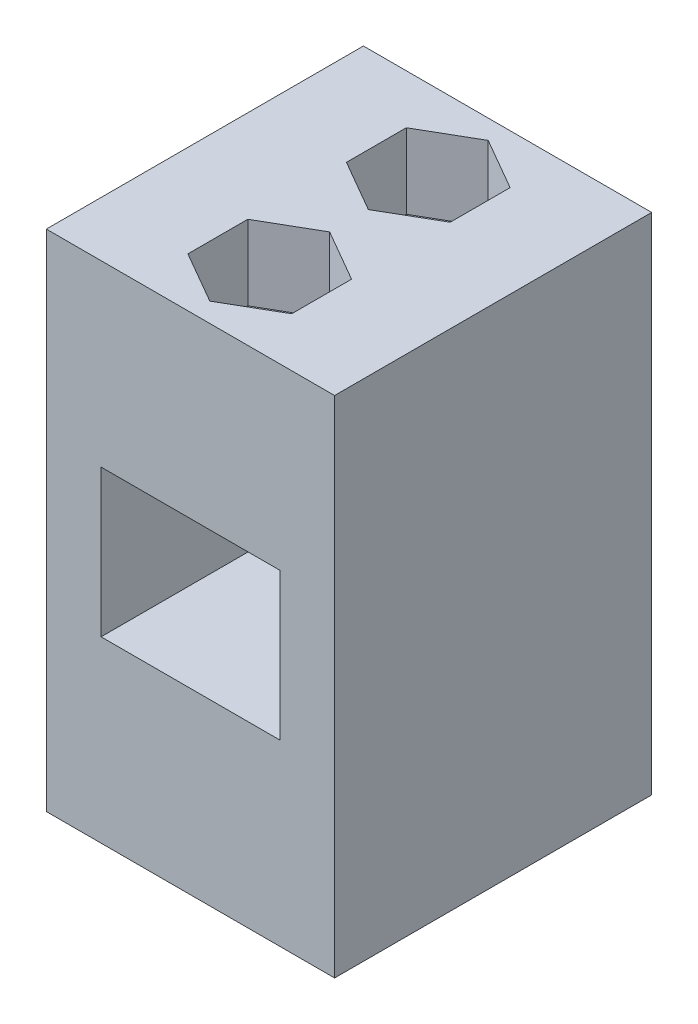
ISO-10303-21;
HEADER;
FILE_DESCRIPTION(('STEP AP214'),'2;1');
FILE_NAME('part.step','',(''),(''),'','','');
FILE_SCHEMA(('AUTOMOTIVE_DESIGN { 1 0 10303 214 1 1 1 1 }'));
ENDSEC;
DATA;
#1=APPLICATION_CONTEXT('core data for automotive mechanical design processes');
#2=APPLICATION_PROTOCOL_DEFINITION('international standard','automotive_design',2000,#1);
#3=PRODUCT_CONTEXT('',#1,'mechanical');
#4=PRODUCT('Part','Part','',(#3));
#5=PRODUCT_RELATED_PRODUCT_CATEGORY('part','',(#4));
#6=PRODUCT_DEFINITION_FORMATION('','',#4);
#7=PRODUCT_DEFINITION_CONTEXT('part definition',#1,'design');
#8=PRODUCT_DEFINITION('design','',#6,#7);
#9=PRODUCT_DEFINITION_SHAPE('','',#8);
#10=(LENGTH_UNIT() NAMED_UNIT(*) SI_UNIT(.MILLI.,.METRE.));
#11=(NAMED_UNIT(*) PLANE_ANGLE_UNIT() SI_UNIT($,.RADIAN.));
#12=(NAMED_UNIT(*) SI_UNIT($,.STERADIAN.) SOLID_ANGLE_UNIT());
#13=UNCERTAINTY_MEASURE_WITH_UNIT(LENGTH_MEASURE(1.E-05),#10,'distance_accuracy_value','');
#14=(GEOMETRIC_REPRESENTATION_CONTEXT(3) GLOBAL_UNCERTAINTY_ASSIGNED_CONTEXT((#13)) GLOBAL_UNIT_ASSIGNED_CONTEXT((#10,
#11,#12)) REPRESENTATION_CONTEXT('',''));
#15=CARTESIAN_POINT('',(0.,0.,0.));
#16=DIRECTION('',(0.,0.,1.));
#17=DIRECTION('',(1.,0.,0.));
#18=AXIS2_PLACEMENT_3D('',#15,#16,#17);
#19=CARTESIAN_POINT('',(-10.,-17.5,11.));
#20=DIRECTION('',(0.,-1.,0.));
#21=DIRECTION('',(0.,0.,-1.));
#22=AXIS2_PLACEMENT_3D('',#19,#20,#21);
#23=PLANE('',#22);
#24=DIRECTION('',(0.,0.,1.));
#25=VECTOR('',#24,1.);
#26=CARTESIAN_POINT('',(3.59999999999999,-17.5,3.42153903091735));
#27=LINE('',#26,#25);
#28=CARTESIAN_POINT('',(3.59999999999999,-17.5,3.42153903091735));
#29=VERTEX_POINT('',#28);
#30=CARTESIAN_POINT('',(3.6,-17.5,7.57846096908265));
#31=VERTEX_POINT('',#30);
#32=EDGE_CURVE('E57',#29,#31,#27,.T.);
#33=ORIENTED_EDGE('',*,*,#32,.F.);
#34=DIRECTION('',(0.866025403784439,0.,0.5));
#35=VECTOR('',#34,1.);
#36=CARTESIAN_POINT('',(0.,-17.5,1.3430780618347));
#37=LINE('',#36,#35);
#38=CARTESIAN_POINT('',(0.,-17.5,1.3430780618347));
#39=VERTEX_POINT('',#38);
#40=EDGE_CURVE('E276',#39,#29,#37,.T.);
#41=ORIENTED_EDGE('',*,*,#40,.F.);
#42=DIRECTION('',(0.866025403784439,0.,-0.5));
#43=VECTOR('',#42,1.);
#44=CARTESIAN_POINT('',(-3.59999999999999,-17.5,3.42153903091735));
#45=LINE('',#44,#43);
#46=CARTESIAN_POINT('',(-3.59999999999999,-17.5,3.42153903091735));
#47=VERTEX_POINT('',#46);
#48=EDGE_CURVE('E279',#47,#39,#45,.T.);
#49=ORIENTED_EDGE('',*,*,#48,.F.);
#50=DIRECTION('',(0.,0.,-1.));
#51=VECTOR('',#50,1.);
#52=CARTESIAN_POINT('',(-3.59999999999999,-17.5,7.57846096908265));
#53=LINE('',#52,#51);
#54=CARTESIAN_POINT('',(-3.59999999999999,-17.5,7.57846096908265));
#55=VERTEX_POINT('',#54);
#56=EDGE_CURVE('E295',#55,#47,#53,.T.);
#57=ORIENTED_EDGE('',*,*,#56,.F.);
#58=DIRECTION('',(-0.866025403784439,0.,-0.5));
#59=VECTOR('',#58,1.);
#60=CARTESIAN_POINT('',(0.,-17.5,9.6569219381653));
#61=LINE('',#60,#59);
#62=CARTESIAN_POINT('',(0.,-17.5,9.6569219381653));
#63=VERTEX_POINT('',#62);
#64=EDGE_CURVE('E292',#63,#55,#61,.T.);
#65=ORIENTED_EDGE('',*,*,#64,.F.);
#66=DIRECTION('',(-0.866025403784438,0.,0.5));
#67=VECTOR('',#66,1.);
#68=CARTESIAN_POINT('',(3.6,-17.5,7.57846096908265));
#69=LINE('',#68,#67);
#70=EDGE_CURVE('E290',#31,#63,#69,.T.);
#71=ORIENTED_EDGE('',*,*,#70,.F.);
#72=EDGE_LOOP('',(#33,#41,#49,#57,#65,#71));
#73=FACE_BOUND('',#72,.T.);
#74=DIRECTION('',(1.,0.,0.));
#75=VECTOR('',#74,1.);
#76=CARTESIAN_POINT('',(-10.,-17.5,-11.));
#77=LINE('',#76,#75);
#78=CARTESIAN_POINT('',(-10.,-17.5,-11.));
#79=VERTEX_POINT('',#78);
#80=CARTESIAN_POINT('',(10.,-17.5,-11.));
#81=VERTEX_POINT('',#80);
#82=EDGE_CURVE('E503',#79,#81,#77,.T.);
#83=ORIENTED_EDGE('',*,*,#82,.T.);
#84=DIRECTION('',(0.,0.,-1.));
#85=VECTOR('',#84,1.);
#86=CARTESIAN_POINT('',(10.,-17.5,11.));
#87=LINE('',#86,#85);
#88=CARTESIAN_POINT('',(10.,-17.5,11.));
#89=VERTEX_POINT('',#88);
#90=EDGE_CURVE('E486',#89,#81,#87,.T.);
#91=ORIENTED_EDGE('',*,*,#90,.F.);
#92=DIRECTION('',(1.,0.,0.));
#93=VECTOR('',#92,1.);
#94=CARTESIAN_POINT('',(-10.,-17.5,11.));
#95=LINE('',#94,#93);
#96=CARTESIAN_POINT('',(-10.,-17.5,11.));
#97=VERTEX_POINT('',#96);
#98=EDGE_CURVE('E506',#97,#89,#95,.T.);
#99=ORIENTED_EDGE('',*,*,#98,.F.);
#100=DIRECTION('',(0.,0.,-1.));
#101=VECTOR('',#100,1.);
#102=CARTESIAN_POINT('',(-10.,-17.5,11.));
#103=LINE('',#102,#101);
#104=EDGE_CURVE('E499',#97,#79,#103,.T.);
#105=ORIENTED_EDGE('',*,*,#104,.T.);
#106=EDGE_LOOP('',(#83,#91,#99,#105));
#107=FACE_BOUND('',#106,.T.);
#108=DIRECTION('',(0.866025403784439,0.,-0.5));
#109=VECTOR('',#108,1.);
#110=CARTESIAN_POINT('',(0.,-17.5,-1.3430780618347));
#111=LINE('',#110,#109);
#112=CARTESIAN_POINT('',(0.,-17.5,-1.3430780618347));
#113=VERTEX_POINT('',#112);
#114=CARTESIAN_POINT('',(3.59999999999999,-17.5,-3.42153903091735));
#115=VERTEX_POINT('',#114);
#116=EDGE_CURVE('E325',#113,#115,#111,.T.);
#117=ORIENTED_EDGE('',*,*,#116,.T.);
#118=DIRECTION('',(0.,0.,-1.));
#119=VECTOR('',#118,1.);
#120=CARTESIAN_POINT('',(3.59999999999999,-17.5,-3.42153903091735));
#121=LINE('',#120,#119);
#122=CARTESIAN_POINT('',(3.6,-17.5,-7.57846096908265));
#123=VERTEX_POINT('',#122);
#124=EDGE_CURVE('E65',#115,#123,#121,.T.);
#125=ORIENTED_EDGE('',*,*,#124,.T.);
#126=DIRECTION('',(-0.866025403784438,0.,-0.5));
#127=VECTOR('',#126,1.);
#128=CARTESIAN_POINT('',(3.6,-17.5,-7.57846096908265));
#129=LINE('',#128,#127);
#130=CARTESIAN_POINT('',(0.,-17.5,-9.6569219381653));
#131=VERTEX_POINT('',#130);
#132=EDGE_CURVE('E313',#123,#131,#129,.T.);
#133=ORIENTED_EDGE('',*,*,#132,.T.);
#134=DIRECTION('',(-0.866025403784439,0.,0.5));
#135=VECTOR('',#134,1.);
#136=CARTESIAN_POINT('',(0.,-17.5,-9.6569219381653));
#137=LINE('',#136,#135);
#138=CARTESIAN_POINT('',(-3.59999999999999,-17.5,-7.57846096908265));
#139=VERTEX_POINT('',#138);
#140=EDGE_CURVE('E334',#131,#139,#137,.T.);
#141=ORIENTED_EDGE('',*,*,#140,.T.);
#142=DIRECTION('',(0.,0.,1.));
#143=VECTOR('',#142,1.);
#144=CARTESIAN_POINT('',(-3.59999999999999,-17.5,-7.57846096908265));
#145=LINE('',#144,#143);
#146=CARTESIAN_POINT('',(-3.59999999999999,-17.5,-3.42153903091735));
#147=VERTEX_POINT('',#146);
#148=EDGE_CURVE('E331',#139,#147,#145,.T.);
#149=ORIENTED_EDGE('',*,*,#148,.T.);
#150=DIRECTION('',(0.866025403784439,0.,0.5));
#151=VECTOR('',#150,1.);
#152=CARTESIAN_POINT('',(-3.59999999999999,-17.5,-3.42153903091735));
#153=LINE('',#152,#151);
#154=EDGE_CURVE('E328',#147,#113,#153,.T.);
#155=ORIENTED_EDGE('',*,*,#154,.T.);
#156=EDGE_LOOP('',(#117,#125,#133,#141,#149,#155));
#157=FACE_BOUND('',#156,.T.);
#158=ADVANCED_FACE('F42',(#73,#107,#157),#23,.T.);
#159=CARTESIAN_POINT('',(-10.,17.5,11.));
#160=DIRECTION('',(0.,1.,0.));
#161=DIRECTION('',(0.,0.,1.));
#162=AXIS2_PLACEMENT_3D('',#159,#160,#161);
#163=PLANE('',#162);
#164=DIRECTION('',(0.,0.,-1.));
#165=VECTOR('',#164,1.);
#166=CARTESIAN_POINT('',(3.59999999999999,17.5,-3.42153903091735));
#167=LINE('',#166,#165);
#168=CARTESIAN_POINT('',(3.59999999999999,17.5,-3.42153903091735));
#169=VERTEX_POINT('',#168);
#170=CARTESIAN_POINT('',(3.6,17.5,-7.57846096908266));
#171=VERTEX_POINT('',#170);
#172=EDGE_CURVE('E385',#169,#171,#167,.T.);
#173=ORIENTED_EDGE('',*,*,#172,.F.);
#174=DIRECTION('',(0.866025403784439,0.,-0.5));
#175=VECTOR('',#174,1.);
#176=CARTESIAN_POINT('',(0.,17.5,-1.3430780618347));
#177=LINE('',#176,#175);
#178=CARTESIAN_POINT('',(0.,17.5,-1.3430780618347));
#179=VERTEX_POINT('',#178);
#180=EDGE_CURVE('E401',#179,#169,#177,.T.);
#181=ORIENTED_EDGE('',*,*,#180,.F.);
#182=DIRECTION('',(0.866025403784439,0.,0.5));
#183=VECTOR('',#182,1.);
#184=CARTESIAN_POINT('',(-3.59999999999999,17.5,-3.42153903091735));
#185=LINE('',#184,#183);
#186=CARTESIAN_POINT('',(-3.59999999999999,17.5,-3.42153903091735));
#187=VERTEX_POINT('',#186);
#188=EDGE_CURVE('E431',#187,#179,#185,.T.);
#189=ORIENTED_EDGE('',*,*,#188,.F.);
#190=DIRECTION('',(0.,0.,1.));
#191=VECTOR('',#190,1.);
#192=CARTESIAN_POINT('',(-3.59999999999999,17.5,-7.57846096908265));
#193=LINE('',#192,#191);
#194=CARTESIAN_POINT('',(-3.59999999999999,17.5,-7.57846096908265));
#195=VERTEX_POINT('',#194);
#196=EDGE_CURVE('E427',#195,#187,#193,.T.);
#197=ORIENTED_EDGE('',*,*,#196,.F.);
#198=DIRECTION('',(-0.866025403784439,0.,0.5));
#199=VECTOR('',#198,1.);
#200=CARTESIAN_POINT('',(0.,17.5,-9.6569219381653));
#201=LINE('',#200,#199);
#202=CARTESIAN_POINT('',(0.,17.5,-9.6569219381653));
#203=VERTEX_POINT('',#202);
#204=EDGE_CURVE('E424',#203,#195,#201,.T.);
#205=ORIENTED_EDGE('',*,*,#204,.F.);
#206=DIRECTION('',(-0.866025403784438,0.,-0.5));
#207=VECTOR('',#206,1.);
#208=CARTESIAN_POINT('',(3.6,17.5,-7.57846096908265));
#209=LINE('',#208,#207);
#210=EDGE_CURVE('E421',#171,#203,#209,.T.);
#211=ORIENTED_EDGE('',*,*,#210,.F.);
#212=EDGE_LOOP('',(#173,#181,#189,#197,#205,#211));
#213=FACE_BOUND('',#212,.T.);
#214=DIRECTION('',(1.,0.,0.));
#215=VECTOR('',#214,1.);
#216=CARTESIAN_POINT('',(-10.,17.5,11.));
#217=LINE('',#216,#215);
#218=CARTESIAN_POINT('',(-10.,17.5,11.));
#219=VERTEX_POINT('',#218);
#220=CARTESIAN_POINT('',(10.,17.5,11.));
#221=VERTEX_POINT('',#220);
#222=EDGE_CURVE('E508',#219,#221,#217,.T.);
#223=ORIENTED_EDGE('',*,*,#222,.T.);
#224=DIRECTION('',(0.,0.,1.));
#225=VECTOR('',#224,1.);
#226=CARTESIAN_POINT('',(10.,17.5,11.));
#227=LINE('',#226,#225);
#228=CARTESIAN_POINT('',(10.,17.5,-11.));
#229=VERTEX_POINT('',#228);
#230=EDGE_CURVE('E480',#229,#221,#227,.T.);
#231=ORIENTED_EDGE('',*,*,#230,.F.);
#232=DIRECTION('',(1.,0.,0.));
#233=VECTOR('',#232,1.);
#234=CARTESIAN_POINT('',(-10.,17.5,-11.));
#235=LINE('',#234,#233);
#236=CARTESIAN_POINT('',(-10.,17.5,-11.));
#237=VERTEX_POINT('',#236);
#238=EDGE_CURVE('E502',#237,#229,#235,.T.);
#239=ORIENTED_EDGE('',*,*,#238,.F.);
#240=DIRECTION('',(0.,0.,1.));
#241=VECTOR('',#240,1.);
#242=CARTESIAN_POINT('',(-10.,17.5,11.));
#243=LINE('',#242,#241);
#244=EDGE_CURVE('E493',#237,#219,#243,.T.);
#245=ORIENTED_EDGE('',*,*,#244,.T.);
#246=EDGE_LOOP('',(#223,#231,#239,#245));
#247=FACE_BOUND('',#246,.T.);
#248=DIRECTION('',(0.866025403784439,0.,0.5));
#249=VECTOR('',#248,1.);
#250=CARTESIAN_POINT('',(0.,17.5,1.3430780618347));
#251=LINE('',#250,#249);
#252=CARTESIAN_POINT('',(0.,17.5,1.3430780618347));
#253=VERTEX_POINT('',#252);
#254=CARTESIAN_POINT('',(3.6,17.5,3.42153903091735));
#255=VERTEX_POINT('',#254);
#256=EDGE_CURVE('E368',#253,#255,#251,.T.);
#257=ORIENTED_EDGE('',*,*,#256,.T.);
#258=DIRECTION('',(0.,0.,1.));
#259=VECTOR('',#258,1.);
#260=CARTESIAN_POINT('',(3.59999999999999,17.5,3.42153903091735));
#261=LINE('',#260,#259);
#262=CARTESIAN_POINT('',(3.6,17.5,7.57846096908265));
#263=VERTEX_POINT('',#262);
#264=EDGE_CURVE('E341',#255,#263,#261,.T.);
#265=ORIENTED_EDGE('',*,*,#264,.T.);
#266=DIRECTION('',(-0.866025403784438,0.,0.5));
#267=VECTOR('',#266,1.);
#268=CARTESIAN_POINT('',(3.6,17.5,7.57846096908265));
#269=LINE('',#268,#267);
#270=CARTESIAN_POINT('',(0.,17.5,9.6569219381653));
#271=VERTEX_POINT('',#270);
#272=EDGE_CURVE('E355',#263,#271,#269,.T.);
#273=ORIENTED_EDGE('',*,*,#272,.T.);
#274=DIRECTION('',(-0.866025403784439,0.,-0.5));
#275=VECTOR('',#274,1.);
#276=CARTESIAN_POINT('',(0.,17.5,9.6569219381653));
#277=LINE('',#276,#275);
#278=CARTESIAN_POINT('',(-3.59999999999999,17.5,7.57846096908265));
#279=VERTEX_POINT('',#278);
#280=EDGE_CURVE('E377',#271,#279,#277,.T.);
#281=ORIENTED_EDGE('',*,*,#280,.T.);
#282=DIRECTION('',(0.,0.,-1.));
#283=VECTOR('',#282,1.);
#284=CARTESIAN_POINT('',(-3.59999999999999,17.5,7.57846096908265));
#285=LINE('',#284,#283);
#286=CARTESIAN_POINT('',(-3.59999999999999,17.5,3.42153903091735));
#287=VERTEX_POINT('',#286);
#288=EDGE_CURVE('E374',#279,#287,#285,.T.);
#289=ORIENTED_EDGE('',*,*,#288,.T.);
#290=DIRECTION('',(0.866025403784439,0.,-0.5));
#291=VECTOR('',#290,1.);
#292=CARTESIAN_POINT('',(-3.59999999999999,17.5,3.42153903091735));
#293=LINE('',#292,#291);
#294=EDGE_CURVE('E371',#287,#253,#293,.T.);
#295=ORIENTED_EDGE('',*,*,#294,.T.);
#296=EDGE_LOOP('',(#257,#265,#273,#281,#289,#295));
#297=FACE_BOUND('',#296,.T.);
#298=ADVANCED_FACE('F535',(#213,#247,#297),#163,.T.);
#299=CARTESIAN_POINT('',(-10.,17.5,-11.));
#300=DIRECTION('',(0.,0.,-1.));
#301=DIRECTION('',(0.,1.,0.));
#302=AXIS2_PLACEMENT_3D('',#299,#300,#301);
#303=PLANE('',#302);
#304=DIRECTION('',(0.,1.,0.));
#305=VECTOR('',#304,1.);
#306=CARTESIAN_POINT('',(6.2,5.1,-11.));
#307=LINE('',#306,#305);
#308=CARTESIAN_POINT('',(6.2,-5.1,-11.));
#309=VERTEX_POINT('',#308);
#310=CARTESIAN_POINT('',(6.2,5.1,-11.));
#311=VERTEX_POINT('',#310);
#312=EDGE_CURVE('E439',#309,#311,#307,.T.);
#313=ORIENTED_EDGE('',*,*,#312,.T.);
#314=DIRECTION('',(-1.,0.,0.));
#315=VECTOR('',#314,1.);
#316=CARTESIAN_POINT('',(-6.2,5.1,-11.));
#317=LINE('',#316,#315);
#318=CARTESIAN_POINT('',(-6.2,5.1,-11.));
#319=VERTEX_POINT('',#318);
#320=EDGE_CURVE('E454',#311,#319,#317,.T.);
#321=ORIENTED_EDGE('',*,*,#320,.T.);
#322=DIRECTION('',(0.,-1.,0.));
#323=VECTOR('',#322,1.);
#324=CARTESIAN_POINT('',(-6.2,5.1,-11.));
#325=LINE('',#324,#323);
#326=CARTESIAN_POINT('',(-6.2,-5.1,-11.));
#327=VERTEX_POINT('',#326);
#328=EDGE_CURVE('E457',#319,#327,#325,.T.);
#329=ORIENTED_EDGE('',*,*,#328,.T.);
#330=DIRECTION('',(1.,0.,0.));
#331=VECTOR('',#330,1.);
#332=CARTESIAN_POINT('',(-6.2,-5.1,-11.));
#333=LINE('',#332,#331);
#334=EDGE_CURVE('E460',#327,#309,#333,.T.);
#335=ORIENTED_EDGE('',*,*,#334,.T.);
#336=EDGE_LOOP('',(#313,#321,#329,#335));
#337=FACE_BOUND('',#336,.T.);
#338=ORIENTED_EDGE('',*,*,#238,.T.);
#339=DIRECTION('',(0.,1.,0.));
#340=VECTOR('',#339,1.);
#341=CARTESIAN_POINT('',(10.,17.5,-11.));
#342=LINE('',#341,#340);
#343=EDGE_CURVE('E467',#81,#229,#342,.T.);
#344=ORIENTED_EDGE('',*,*,#343,.F.);
#345=ORIENTED_EDGE('',*,*,#82,.F.);
#346=DIRECTION('',(0.,1.,0.));
#347=VECTOR('',#346,1.);
#348=CARTESIAN_POINT('',(-10.,17.5,-11.));
#349=LINE('',#348,#347);
#350=EDGE_CURVE('E489',#79,#237,#349,.T.);
#351=ORIENTED_EDGE('',*,*,#350,.T.);
#352=EDGE_LOOP('',(#338,#344,#345,#351));
#353=FACE_BOUND('',#352,.T.);
#354=ADVANCED_FACE('F44',(#337,#353),#303,.T.);
#355=CARTESIAN_POINT('',(-10.,17.5,11.));
#356=DIRECTION('',(0.,0.,1.));
#357=DIRECTION('',(0.,-1.,0.));
#358=AXIS2_PLACEMENT_3D('',#355,#356,#357);
#359=PLANE('',#358);
#360=DIRECTION('',(0.,1.,0.));
#361=VECTOR('',#360,1.);
#362=CARTESIAN_POINT('',(6.2,17.5,11.));
#363=LINE('',#362,#361);
#364=CARTESIAN_POINT('',(6.2,-5.1,11.));
#365=VERTEX_POINT('',#364);
#366=CARTESIAN_POINT('',(6.2,5.1,11.));
#367=VERTEX_POINT('',#366);
#368=EDGE_CURVE('E11',#365,#367,#363,.T.);
#369=ORIENTED_EDGE('',*,*,#368,.F.);
#370=DIRECTION('',(1.,0.,0.));
#371=VECTOR('',#370,1.);
#372=CARTESIAN_POINT('',(-10.,-5.1,11.));
#373=LINE('',#372,#371);
#374=CARTESIAN_POINT('',(-6.2,-5.1,11.));
#375=VERTEX_POINT('',#374);
#376=EDGE_CURVE('E50',#375,#365,#373,.T.);
#377=ORIENTED_EDGE('',*,*,#376,.F.);
#378=DIRECTION('',(0.,-1.,0.));
#379=VECTOR('',#378,1.);
#380=CARTESIAN_POINT('',(-6.2,17.5,11.));
#381=LINE('',#380,#379);
#382=CARTESIAN_POINT('',(-6.2,5.1,11.));
#383=VERTEX_POINT('',#382);
#384=EDGE_CURVE('E512',#383,#375,#381,.T.);
#385=ORIENTED_EDGE('',*,*,#384,.F.);
#386=DIRECTION('',(-1.,0.,0.));
#387=VECTOR('',#386,1.);
#388=CARTESIAN_POINT('',(-10.,5.1,11.));
#389=LINE('',#388,#387);
#390=EDGE_CURVE('E505',#367,#383,#389,.T.);
#391=ORIENTED_EDGE('',*,*,#390,.F.);
#392=EDGE_LOOP('',(#369,#377,#385,#391));
#393=FACE_BOUND('',#392,.T.);
#394=ORIENTED_EDGE('',*,*,#98,.T.);
#395=DIRECTION('',(0.,-1.,0.));
#396=VECTOR('',#395,1.);
#397=CARTESIAN_POINT('',(10.,17.5,11.));
#398=LINE('',#397,#396);
#399=EDGE_CURVE('E483',#221,#89,#398,.T.);
#400=ORIENTED_EDGE('',*,*,#399,.F.);
#401=ORIENTED_EDGE('',*,*,#222,.F.);
#402=DIRECTION('',(0.,-1.,0.));
#403=VECTOR('',#402,1.);
#404=CARTESIAN_POINT('',(-10.,17.5,11.));
#405=LINE('',#404,#403);
#406=EDGE_CURVE('E496',#219,#97,#405,.T.);
#407=ORIENTED_EDGE('',*,*,#406,.T.);
#408=EDGE_LOOP('',(#394,#400,#401,#407));
#409=FACE_BOUND('',#408,.T.);
#410=ADVANCED_FACE('F524',(#393,#409),#359,.T.);
#411=CARTESIAN_POINT('',(-10.,0.,0.));
#412=DIRECTION('',(1.,0.,0.));
#413=DIRECTION('',(0.,0.,-1.));
#414=AXIS2_PLACEMENT_3D('',#411,#412,#413);
#415=PLANE('',#414);
#416=ORIENTED_EDGE('',*,*,#350,.F.);
#417=ORIENTED_EDGE('',*,*,#104,.F.);
#418=ORIENTED_EDGE('',*,*,#406,.F.);
#419=ORIENTED_EDGE('',*,*,#244,.F.);
#420=EDGE_LOOP('',(#416,#417,#418,#419));
#421=FACE_BOUND('',#420,.T.);
#422=ADVANCED_FACE('F550',(#421),#415,.F.);
#423=CARTESIAN_POINT('',(10.,0.,0.));
#424=DIRECTION('',(1.,0.,0.));
#425=DIRECTION('',(0.,0.,-1.));
#426=AXIS2_PLACEMENT_3D('',#423,#424,#425);
#427=PLANE('',#426);
#428=ORIENTED_EDGE('',*,*,#343,.T.);
#429=ORIENTED_EDGE('',*,*,#230,.T.);
#430=ORIENTED_EDGE('',*,*,#399,.T.);
#431=ORIENTED_EDGE('',*,*,#90,.T.);
#432=EDGE_LOOP('',(#428,#429,#430,#431));
#433=FACE_BOUND('',#432,.T.);
#434=ADVANCED_FACE('F544',(#433),#427,.T.);
#435=CARTESIAN_POINT('',(6.2,5.1,-11.));
#436=DIRECTION('',(1.,0.,0.));
#437=DIRECTION('',(0.,1.,0.));
#438=AXIS2_PLACEMENT_3D('',#435,#436,#437);
#439=PLANE('',#438);
#440=ORIENTED_EDGE('',*,*,#368,.T.);
#441=DIRECTION('',(0.,0.,1.));
#442=VECTOR('',#441,1.);
#443=CARTESIAN_POINT('',(6.2,5.1,-11.));
#444=LINE('',#443,#442);
#445=EDGE_CURVE('E463',#311,#367,#444,.T.);
#446=ORIENTED_EDGE('',*,*,#445,.F.);
#447=ORIENTED_EDGE('',*,*,#312,.F.);
#448=DIRECTION('',(0.,0.,1.));
#449=VECTOR('',#448,1.);
#450=CARTESIAN_POINT('',(6.2,-5.1,-11.));
#451=LINE('',#450,#449);
#452=EDGE_CURVE('E464',#309,#365,#451,.T.);
#453=ORIENTED_EDGE('',*,*,#452,.T.);
#454=EDGE_LOOP('',(#440,#446,#447,#453));
#455=FACE_BOUND('',#454,.T.);
#456=ADVANCED_FACE('F522',(#455),#439,.F.);
#457=CARTESIAN_POINT('',(-6.2,-5.1,-11.));
#458=DIRECTION('',(0.,-1.,0.));
#459=DIRECTION('',(0.,0.,-1.));
#460=AXIS2_PLACEMENT_3D('',#457,#458,#459);
#461=PLANE('',#460);
#462=ORIENTED_EDGE('',*,*,#376,.T.);
#463=ORIENTED_EDGE('',*,*,#452,.F.);
#464=ORIENTED_EDGE('',*,*,#334,.F.);
#465=DIRECTION('',(0.,0.,1.));
#466=VECTOR('',#465,1.);
#467=CARTESIAN_POINT('',(-6.2,-5.1,-11.));
#468=LINE('',#467,#466);
#469=EDGE_CURVE('E468',#327,#375,#468,.T.);
#470=ORIENTED_EDGE('',*,*,#469,.T.);
#471=EDGE_LOOP('',(#462,#463,#464,#470));
#472=FACE_BOUND('',#471,.T.);
#473=ADVANCED_FACE('F515',(#472),#461,.F.);
#474=CARTESIAN_POINT('',(-6.2,5.1,-11.));
#475=DIRECTION('',(-1.,0.,0.));
#476=DIRECTION('',(0.,-1.,0.));
#477=AXIS2_PLACEMENT_3D('',#474,#475,#476);
#478=PLANE('',#477);
#479=ORIENTED_EDGE('',*,*,#384,.T.);
#480=ORIENTED_EDGE('',*,*,#469,.F.);
#481=ORIENTED_EDGE('',*,*,#328,.F.);
#482=DIRECTION('',(0.,0.,1.));
#483=VECTOR('',#482,1.);
#484=CARTESIAN_POINT('',(-6.2,5.1,-11.));
#485=LINE('',#484,#483);
#486=EDGE_CURVE('E471',#319,#383,#485,.T.);
#487=ORIENTED_EDGE('',*,*,#486,.T.);
#488=EDGE_LOOP('',(#479,#480,#481,#487));
#489=FACE_BOUND('',#488,.T.);
#490=ADVANCED_FACE('F531',(#489),#478,.F.);
#491=CARTESIAN_POINT('',(-6.2,5.1,-11.));
#492=DIRECTION('',(0.,1.,0.));
#493=DIRECTION('',(0.,0.,1.));
#494=AXIS2_PLACEMENT_3D('',#491,#492,#493);
#495=PLANE('',#494);
#496=ORIENTED_EDGE('',*,*,#390,.T.);
#497=ORIENTED_EDGE('',*,*,#486,.F.);
#498=ORIENTED_EDGE('',*,*,#320,.F.);
#499=ORIENTED_EDGE('',*,*,#445,.T.);
#500=EDGE_LOOP('',(#496,#497,#498,#499));
#501=FACE_BOUND('',#500,.T.);
#502=ADVANCED_FACE('F528',(#501),#495,.F.);
#503=CARTESIAN_POINT('',(3.59999999999999,12.3,-3.42153903091735));
#504=DIRECTION('',(1.,0.,0.));
#505=DIRECTION('',(0.,0.,-1.));
#506=AXIS2_PLACEMENT_3D('',#503,#504,#505);
#507=PLANE('',#506);
#508=ORIENTED_EDGE('',*,*,#172,.T.);
#509=DIRECTION('',(0.,1.,0.));
#510=VECTOR('',#509,1.);
#511=CARTESIAN_POINT('',(3.6,12.3,-7.57846096908265));
#512=LINE('',#511,#510);
#513=CARTESIAN_POINT('',(3.6,12.3,-7.57846096908265));
#514=VERTEX_POINT('',#513);
#515=EDGE_CURVE('E419',#514,#171,#512,.T.);
#516=ORIENTED_EDGE('',*,*,#515,.F.);
#517=DIRECTION('',(0.,0.,-1.));
#518=VECTOR('',#517,1.);
#519=CARTESIAN_POINT('',(3.59999999999999,12.3,-3.42153903091735));
#520=LINE('',#519,#518);
#521=CARTESIAN_POINT('',(3.59999999999999,12.3,-3.42153903091735));
#522=VERTEX_POINT('',#521);
#523=EDGE_CURVE('E396',#522,#514,#520,.T.);
#524=ORIENTED_EDGE('',*,*,#523,.F.);
#525=DIRECTION('',(0.,1.,0.));
#526=VECTOR('',#525,1.);
#527=CARTESIAN_POINT('',(3.59999999999999,12.3,-3.42153903091735));
#528=LINE('',#527,#526);
#529=EDGE_CURVE('E437',#522,#169,#528,.T.);
#530=ORIENTED_EDGE('',*,*,#529,.T.);
#531=EDGE_LOOP('',(#508,#516,#524,#530));
#532=FACE_BOUND('',#531,.T.);
#533=ADVANCED_FACE('F576',(#532),#507,.F.);
#534=CARTESIAN_POINT('',(0.,12.3,-1.3430780618347));
#535=DIRECTION('',(0.5,0.,0.866025403784439));
#536=DIRECTION('',(0.866025403784439,0.,-0.5));
#537=AXIS2_PLACEMENT_3D('',#534,#535,#536);
#538=PLANE('',#537);
#539=ORIENTED_EDGE('',*,*,#180,.T.);
#540=ORIENTED_EDGE('',*,*,#529,.F.);
#541=DIRECTION('',(0.866025403784439,0.,-0.5));
#542=VECTOR('',#541,1.);
#543=CARTESIAN_POINT('',(0.,12.3,-1.3430780618347));
#544=LINE('',#543,#542);
#545=CARTESIAN_POINT('',(0.,12.3,-1.3430780618347));
#546=VERTEX_POINT('',#545);
#547=EDGE_CURVE('E415',#546,#522,#544,.T.);
#548=ORIENTED_EDGE('',*,*,#547,.F.);
#549=DIRECTION('',(0.,1.,0.));
#550=VECTOR('',#549,1.);
#551=CARTESIAN_POINT('',(0.,12.3,-1.3430780618347));
#552=LINE('',#551,#550);
#553=EDGE_CURVE('E440',#546,#179,#552,.T.);
#554=ORIENTED_EDGE('',*,*,#553,.T.);
#555=EDGE_LOOP('',(#539,#540,#548,#554));
#556=FACE_BOUND('',#555,.T.);
#557=ADVANCED_FACE('F583',(#556),#538,.F.);
#558=CARTESIAN_POINT('',(-3.59999999999999,12.3,-3.42153903091735));
#559=DIRECTION('',(-0.5,0.,0.866025403784438));
#560=DIRECTION('',(0.866025403784439,0.,0.5));
#561=AXIS2_PLACEMENT_3D('',#558,#559,#560);
#562=PLANE('',#561);
#563=ORIENTED_EDGE('',*,*,#188,.T.);
#564=ORIENTED_EDGE('',*,*,#553,.F.);
#565=DIRECTION('',(0.866025403784439,0.,0.5));
#566=VECTOR('',#565,1.);
#567=CARTESIAN_POINT('',(-3.59999999999999,12.3,-3.42153903091735));
#568=LINE('',#567,#566);
#569=CARTESIAN_POINT('',(-3.59999999999999,12.3,-3.42153903091735));
#570=VERTEX_POINT('',#569);
#571=EDGE_CURVE('E411',#570,#546,#568,.T.);
#572=ORIENTED_EDGE('',*,*,#571,.F.);
#573=DIRECTION('',(0.,1.,0.));
#574=VECTOR('',#573,1.);
#575=CARTESIAN_POINT('',(-3.59999999999999,12.3,-3.42153903091735));
#576=LINE('',#575,#574);
#577=EDGE_CURVE('E442',#570,#187,#576,.T.);
#578=ORIENTED_EDGE('',*,*,#577,.T.);
#579=EDGE_LOOP('',(#563,#564,#572,#578));
#580=FACE_BOUND('',#579,.T.);
#581=ADVANCED_FACE('F597',(#580),#562,.F.);
#582=CARTESIAN_POINT('',(-3.59999999999999,12.3,-7.57846096908265));
#583=DIRECTION('',(-1.,0.,0.));
#584=DIRECTION('',(0.,0.,1.));
#585=AXIS2_PLACEMENT_3D('',#582,#583,#584);
#586=PLANE('',#585);
#587=ORIENTED_EDGE('',*,*,#196,.T.);
#588=ORIENTED_EDGE('',*,*,#577,.F.);
#589=DIRECTION('',(0.,0.,1.));
#590=VECTOR('',#589,1.);
#591=CARTESIAN_POINT('',(-3.59999999999999,12.3,-7.57846096908265));
#592=LINE('',#591,#590);
#593=CARTESIAN_POINT('',(-3.59999999999999,12.3,-7.57846096908265));
#594=VERTEX_POINT('',#593);
#595=EDGE_CURVE('E408',#594,#570,#592,.T.);
#596=ORIENTED_EDGE('',*,*,#595,.F.);
#597=DIRECTION('',(0.,1.,0.));
#598=VECTOR('',#597,1.);
#599=CARTESIAN_POINT('',(-3.59999999999999,12.3,-7.57846096908265));
#600=LINE('',#599,#598);
#601=EDGE_CURVE('E445',#594,#195,#600,.T.);
#602=ORIENTED_EDGE('',*,*,#601,.T.);
#603=EDGE_LOOP('',(#587,#588,#596,#602));
#604=FACE_BOUND('',#603,.T.);
#605=ADVANCED_FACE('F593',(#604),#586,.F.);
#606=CARTESIAN_POINT('',(0.,12.3,-9.6569219381653));
#607=DIRECTION('',(-0.5,0.,-0.866025403784438));
#608=DIRECTION('',(-0.866025403784439,0.,0.5));
#609=AXIS2_PLACEMENT_3D('',#606,#607,#608);
#610=PLANE('',#609);
#611=ORIENTED_EDGE('',*,*,#204,.T.);
#612=ORIENTED_EDGE('',*,*,#601,.F.);
#613=DIRECTION('',(-0.866025403784439,0.,0.5));
#614=VECTOR('',#613,1.);
#615=CARTESIAN_POINT('',(0.,12.3,-9.6569219381653));
#616=LINE('',#615,#614);
#617=CARTESIAN_POINT('',(0.,12.3,-9.6569219381653));
#618=VERTEX_POINT('',#617);
#619=EDGE_CURVE('E405',#618,#594,#616,.T.);
#620=ORIENTED_EDGE('',*,*,#619,.F.);
#621=DIRECTION('',(0.,1.,0.));
#622=VECTOR('',#621,1.);
#623=CARTESIAN_POINT('',(0.,12.3,-9.6569219381653));
#624=LINE('',#623,#622);
#625=EDGE_CURVE('E447',#618,#203,#624,.T.);
#626=ORIENTED_EDGE('',*,*,#625,.T.);
#627=EDGE_LOOP('',(#611,#612,#620,#626));
#628=FACE_BOUND('',#627,.T.);
#629=ADVANCED_FACE('F589',(#628),#610,.F.);
#630=CARTESIAN_POINT('',(3.6,12.3,-7.57846096908265));
#631=DIRECTION('',(0.5,0.,-0.866025403784438));
#632=DIRECTION('',(-0.866025403784438,0.,-0.5));
#633=AXIS2_PLACEMENT_3D('',#630,#631,#632);
#634=PLANE('',#633);
#635=ORIENTED_EDGE('',*,*,#210,.T.);
#636=ORIENTED_EDGE('',*,*,#625,.F.);
#637=DIRECTION('',(-0.866025403784438,0.,-0.5));
#638=VECTOR('',#637,1.);
#639=CARTESIAN_POINT('',(3.6,12.3,-7.57846096908265));
#640=LINE('',#639,#638);
#641=EDGE_CURVE('E400',#514,#618,#640,.T.);
#642=ORIENTED_EDGE('',*,*,#641,.F.);
#643=ORIENTED_EDGE('',*,*,#515,.T.);
#644=EDGE_LOOP('',(#635,#636,#642,#643));
#645=FACE_BOUND('',#644,.T.);
#646=ADVANCED_FACE('F585',(#645),#634,.F.);
#647=CARTESIAN_POINT('',(0.,12.3,0.));
#648=DIRECTION('',(0.,1.,0.));
#649=DIRECTION('',(0.,0.,1.));
#650=AXIS2_PLACEMENT_3D('',#647,#648,#649);
#651=PLANE('',#650);
#652=ORIENTED_EDGE('',*,*,#523,.T.);
#653=ORIENTED_EDGE('',*,*,#641,.T.);
#654=ORIENTED_EDGE('',*,*,#619,.T.);
#655=ORIENTED_EDGE('',*,*,#595,.T.);
#656=ORIENTED_EDGE('',*,*,#571,.T.);
#657=ORIENTED_EDGE('',*,*,#547,.T.);
#658=EDGE_LOOP('',(#652,#653,#654,#655,#656,#657));
#659=FACE_BOUND('',#658,.T.);
#660=ADVANCED_FACE('F588',(#659),#651,.T.);
#661=CARTESIAN_POINT('',(3.59999999999999,12.3,3.42153903091735));
#662=DIRECTION('',(-1.,0.,0.));
#663=DIRECTION('',(0.,0.,1.));
#664=AXIS2_PLACEMENT_3D('',#661,#662,#663);
#665=PLANE('',#664);
#666=ORIENTED_EDGE('',*,*,#264,.F.);
#667=DIRECTION('',(0.,1.,0.));
#668=VECTOR('',#667,1.);
#669=CARTESIAN_POINT('',(3.59999999999999,12.3,3.42153903091735));
#670=LINE('',#669,#668);
#671=CARTESIAN_POINT('',(3.59999999999999,12.3,3.42153903091735));
#672=VERTEX_POINT('',#671);
#673=EDGE_CURVE('E365',#672,#255,#670,.T.);
#674=ORIENTED_EDGE('',*,*,#673,.F.);
#675=DIRECTION('',(0.,0.,1.));
#676=VECTOR('',#675,1.);
#677=CARTESIAN_POINT('',(3.59999999999999,12.3,3.42153903091735));
#678=LINE('',#677,#676);
#679=CARTESIAN_POINT('',(3.6,12.3,7.57846096908265));
#680=VERTEX_POINT('',#679);
#681=EDGE_CURVE('E351',#672,#680,#678,.T.);
#682=ORIENTED_EDGE('',*,*,#681,.T.);
#683=DIRECTION('',(0.,1.,0.));
#684=VECTOR('',#683,1.);
#685=CARTESIAN_POINT('',(3.6,12.3,7.57846096908265));
#686=LINE('',#685,#684);
#687=EDGE_CURVE('E382',#680,#263,#686,.T.);
#688=ORIENTED_EDGE('',*,*,#687,.T.);
#689=EDGE_LOOP('',(#666,#674,#682,#688));
#690=FACE_BOUND('',#689,.T.);
#691=ADVANCED_FACE('F607',(#690),#665,.T.);
#692=CARTESIAN_POINT('',(3.6,12.3,7.57846096908265));
#693=DIRECTION('',(-0.5,0.,-0.866025403784438));
#694=DIRECTION('',(-0.866025403784438,0.,0.5));
#695=AXIS2_PLACEMENT_3D('',#692,#693,#694);
#696=PLANE('',#695);
#697=ORIENTED_EDGE('',*,*,#272,.F.);
#698=ORIENTED_EDGE('',*,*,#687,.F.);
#699=DIRECTION('',(-0.866025403784438,0.,0.5));
#700=VECTOR('',#699,1.);
#701=CARTESIAN_POINT('',(3.6,12.3,7.57846096908265));
#702=LINE('',#701,#700);
#703=CARTESIAN_POINT('',(0.,12.3,9.6569219381653));
#704=VERTEX_POINT('',#703);
#705=EDGE_CURVE('E363',#680,#704,#702,.T.);
#706=ORIENTED_EDGE('',*,*,#705,.T.);
#707=DIRECTION('',(0.,1.,0.));
#708=VECTOR('',#707,1.);
#709=CARTESIAN_POINT('',(0.,12.3,9.6569219381653));
#710=LINE('',#709,#708);
#711=EDGE_CURVE('E386',#704,#271,#710,.T.);
#712=ORIENTED_EDGE('',*,*,#711,.T.);
#713=EDGE_LOOP('',(#697,#698,#706,#712));
#714=FACE_BOUND('',#713,.T.);
#715=ADVANCED_FACE('F611',(#714),#696,.T.);
#716=CARTESIAN_POINT('',(0.,12.3,9.6569219381653));
#717=DIRECTION('',(0.5,0.,-0.866025403784438));
#718=DIRECTION('',(-0.866025403784439,0.,-0.5));
#719=AXIS2_PLACEMENT_3D('',#716,#717,#718);
#720=PLANE('',#719);
#721=ORIENTED_EDGE('',*,*,#280,.F.);
#722=ORIENTED_EDGE('',*,*,#711,.F.);
#723=DIRECTION('',(-0.866025403784439,0.,-0.5));
#724=VECTOR('',#723,1.);
#725=CARTESIAN_POINT('',(0.,12.3,9.6569219381653));
#726=LINE('',#725,#724);
#727=CARTESIAN_POINT('',(-3.59999999999999,12.3,7.57846096908265));
#728=VERTEX_POINT('',#727);
#729=EDGE_CURVE('E361',#704,#728,#726,.T.);
#730=ORIENTED_EDGE('',*,*,#729,.T.);
#731=DIRECTION('',(0.,1.,0.));
#732=VECTOR('',#731,1.);
#733=CARTESIAN_POINT('',(-3.59999999999999,12.3,7.57846096908265));
#734=LINE('',#733,#732);
#735=EDGE_CURVE('E388',#728,#279,#734,.T.);
#736=ORIENTED_EDGE('',*,*,#735,.T.);
#737=EDGE_LOOP('',(#721,#722,#730,#736));
#738=FACE_BOUND('',#737,.T.);
#739=ADVANCED_FACE('F625',(#738),#720,.T.);
#740=CARTESIAN_POINT('',(-3.59999999999999,12.3,7.57846096908265));
#741=DIRECTION('',(1.,0.,0.));
#742=DIRECTION('',(0.,0.,-1.));
#743=AXIS2_PLACEMENT_3D('',#740,#741,#742);
#744=PLANE('',#743);
#745=ORIENTED_EDGE('',*,*,#288,.F.);
#746=ORIENTED_EDGE('',*,*,#735,.F.);
#747=DIRECTION('',(0.,0.,-1.));
#748=VECTOR('',#747,1.);
#749=CARTESIAN_POINT('',(-3.59999999999999,12.3,7.57846096908265));
#750=LINE('',#749,#748);
#751=CARTESIAN_POINT('',(-3.59999999999999,12.3,3.42153903091735));
#752=VERTEX_POINT('',#751);
#753=EDGE_CURVE('E359',#728,#752,#750,.T.);
#754=ORIENTED_EDGE('',*,*,#753,.T.);
#755=DIRECTION('',(0.,1.,0.));
#756=VECTOR('',#755,1.);
#757=CARTESIAN_POINT('',(-3.59999999999999,12.3,3.42153903091735));
#758=LINE('',#757,#756);
#759=EDGE_CURVE('E390',#752,#287,#758,.T.);
#760=ORIENTED_EDGE('',*,*,#759,.T.);
#761=EDGE_LOOP('',(#745,#746,#754,#760));
#762=FACE_BOUND('',#761,.T.);
#763=ADVANCED_FACE('F621',(#762),#744,.T.);
#764=CARTESIAN_POINT('',(-3.59999999999999,12.3,3.42153903091735));
#765=DIRECTION('',(0.5,0.,0.866025403784438));
#766=DIRECTION('',(0.866025403784439,0.,-0.5));
#767=AXIS2_PLACEMENT_3D('',#764,#765,#766);
#768=PLANE('',#767);
#769=ORIENTED_EDGE('',*,*,#294,.F.);
#770=ORIENTED_EDGE('',*,*,#759,.F.);
#771=DIRECTION('',(0.866025403784439,0.,-0.5));
#772=VECTOR('',#771,1.);
#773=CARTESIAN_POINT('',(-3.59999999999999,12.3,3.42153903091735));
#774=LINE('',#773,#772);
#775=CARTESIAN_POINT('',(0.,12.3,1.3430780618347));
#776=VERTEX_POINT('',#775);
#777=EDGE_CURVE('E357',#752,#776,#774,.T.);
#778=ORIENTED_EDGE('',*,*,#777,.T.);
#779=DIRECTION('',(0.,1.,0.));
#780=VECTOR('',#779,1.);
#781=CARTESIAN_POINT('',(0.,12.3,1.3430780618347));
#782=LINE('',#781,#780);
#783=EDGE_CURVE('E392',#776,#253,#782,.T.);
#784=ORIENTED_EDGE('',*,*,#783,.T.);
#785=EDGE_LOOP('',(#769,#770,#778,#784));
#786=FACE_BOUND('',#785,.T.);
#787=ADVANCED_FACE('F617',(#786),#768,.T.);
#788=CARTESIAN_POINT('',(0.,12.3,1.3430780618347));
#789=DIRECTION('',(-0.5,0.,0.866025403784439));
#790=DIRECTION('',(0.866025403784439,0.,0.5));
#791=AXIS2_PLACEMENT_3D('',#788,#789,#790);
#792=PLANE('',#791);
#793=ORIENTED_EDGE('',*,*,#256,.F.);
#794=ORIENTED_EDGE('',*,*,#783,.F.);
#795=DIRECTION('',(0.866025403784439,0.,0.5));
#796=VECTOR('',#795,1.);
#797=CARTESIAN_POINT('',(0.,12.3,1.3430780618347));
#798=LINE('',#797,#796);
#799=EDGE_CURVE('E354',#776,#672,#798,.T.);
#800=ORIENTED_EDGE('',*,*,#799,.T.);
#801=ORIENTED_EDGE('',*,*,#673,.T.);
#802=EDGE_LOOP('',(#793,#794,#800,#801));
#803=FACE_BOUND('',#802,.T.);
#804=ADVANCED_FACE('F613',(#803),#792,.T.);
#805=CARTESIAN_POINT('',(0.,12.3,0.));
#806=DIRECTION('',(0.,1.,0.));
#807=DIRECTION('',(0.,0.,-1.));
#808=AXIS2_PLACEMENT_3D('',#805,#806,#807);
#809=PLANE('',#808);
#810=ORIENTED_EDGE('',*,*,#681,.F.);
#811=ORIENTED_EDGE('',*,*,#799,.F.);
#812=ORIENTED_EDGE('',*,*,#777,.F.);
#813=ORIENTED_EDGE('',*,*,#753,.F.);
#814=ORIENTED_EDGE('',*,*,#729,.F.);
#815=ORIENTED_EDGE('',*,*,#705,.F.);
#816=EDGE_LOOP('',(#810,#811,#812,#813,#814,#815));
#817=FACE_BOUND('',#816,.T.);
#818=ADVANCED_FACE('F616',(#817),#809,.T.);
#819=CARTESIAN_POINT('',(3.59999999999999,-12.3,-3.42153903091735));
#820=DIRECTION('',(-1.,0.,0.));
#821=DIRECTION('',(0.,0.,1.));
#822=AXIS2_PLACEMENT_3D('',#819,#820,#821);
#823=PLANE('',#822);
#824=ORIENTED_EDGE('',*,*,#124,.F.);
#825=DIRECTION('',(0.,-1.,0.));
#826=VECTOR('',#825,1.);
#827=CARTESIAN_POINT('',(3.59999999999999,-12.3,-3.42153903091735));
#828=LINE('',#827,#826);
#829=CARTESIAN_POINT('',(3.59999999999999,-12.3,-3.42153903091735));
#830=VERTEX_POINT('',#829);
#831=EDGE_CURVE('E323',#830,#115,#828,.T.);
#832=ORIENTED_EDGE('',*,*,#831,.F.);
#833=DIRECTION('',(0.,0.,-1.));
#834=VECTOR('',#833,1.);
#835=CARTESIAN_POINT('',(3.59999999999999,-12.3,-3.42153903091735));
#836=LINE('',#835,#834);
#837=CARTESIAN_POINT('',(3.6,-12.3,-7.57846096908265));
#838=VERTEX_POINT('',#837);
#839=EDGE_CURVE('E309',#830,#838,#836,.T.);
#840=ORIENTED_EDGE('',*,*,#839,.T.);
#841=DIRECTION('',(0.,-1.,0.));
#842=VECTOR('',#841,1.);
#843=CARTESIAN_POINT('',(3.6,-12.3,-7.57846096908265));
#844=LINE('',#843,#842);
#845=EDGE_CURVE('E339',#838,#123,#844,.T.);
#846=ORIENTED_EDGE('',*,*,#845,.T.);
#847=EDGE_LOOP('',(#824,#832,#840,#846));
#848=FACE_BOUND('',#847,.T.);
#849=ADVANCED_FACE('F635',(#848),#823,.T.);
#850=CARTESIAN_POINT('',(3.6,-12.3,-7.57846096908265));
#851=DIRECTION('',(-0.5,0.,0.866025403784438));
#852=DIRECTION('',(0.866025403784438,0.,0.5));
#853=AXIS2_PLACEMENT_3D('',#850,#851,#852);
#854=PLANE('',#853);
#855=ORIENTED_EDGE('',*,*,#132,.F.);
#856=ORIENTED_EDGE('',*,*,#845,.F.);
#857=DIRECTION('',(-0.866025403784438,0.,-0.5));
#858=VECTOR('',#857,1.);
#859=CARTESIAN_POINT('',(3.6,-12.3,-7.57846096908265));
#860=LINE('',#859,#858);
#861=CARTESIAN_POINT('',(0.,-12.3,-9.6569219381653));
#862=VERTEX_POINT('',#861);
#863=EDGE_CURVE('E321',#838,#862,#860,.T.);
#864=ORIENTED_EDGE('',*,*,#863,.T.);
#865=DIRECTION('',(0.,-1.,0.));
#866=VECTOR('',#865,1.);
#867=CARTESIAN_POINT('',(0.,-12.3,-9.6569219381653));
#868=LINE('',#867,#866);
#869=EDGE_CURVE('E342',#862,#131,#868,.T.);
#870=ORIENTED_EDGE('',*,*,#869,.T.);
#871=EDGE_LOOP('',(#855,#856,#864,#870));
#872=FACE_BOUND('',#871,.T.);
#873=ADVANCED_FACE('F639',(#872),#854,.T.);
#874=CARTESIAN_POINT('',(0.,-12.3,-9.6569219381653));
#875=DIRECTION('',(0.5,0.,0.866025403784438));
#876=DIRECTION('',(0.866025403784439,0.,-0.5));
#877=AXIS2_PLACEMENT_3D('',#874,#875,#876);
#878=PLANE('',#877);
#879=ORIENTED_EDGE('',*,*,#140,.F.);
#880=ORIENTED_EDGE('',*,*,#869,.F.);
#881=DIRECTION('',(-0.866025403784439,0.,0.5));
#882=VECTOR('',#881,1.);
#883=CARTESIAN_POINT('',(0.,-12.3,-9.6569219381653));
#884=LINE('',#883,#882);
#885=CARTESIAN_POINT('',(-3.59999999999999,-12.3,-7.57846096908265));
#886=VERTEX_POINT('',#885);
#887=EDGE_CURVE('E319',#862,#886,#884,.T.);
#888=ORIENTED_EDGE('',*,*,#887,.T.);
#889=DIRECTION('',(0.,-1.,0.));
#890=VECTOR('',#889,1.);
#891=CARTESIAN_POINT('',(-3.59999999999999,-12.3,-7.57846096908265));
#892=LINE('',#891,#890);
#893=EDGE_CURVE('E344',#886,#139,#892,.T.);
#894=ORIENTED_EDGE('',*,*,#893,.T.);
#895=EDGE_LOOP('',(#879,#880,#888,#894));
#896=FACE_BOUND('',#895,.T.);
#897=ADVANCED_FACE('F652',(#896),#878,.T.);
#898=CARTESIAN_POINT('',(-3.59999999999999,-12.3,-7.57846096908265));
#899=DIRECTION('',(1.,0.,0.));
#900=DIRECTION('',(0.,0.,-1.));
#901=AXIS2_PLACEMENT_3D('',#898,#899,#900);
#902=PLANE('',#901);
#903=ORIENTED_EDGE('',*,*,#148,.F.);
#904=ORIENTED_EDGE('',*,*,#893,.F.);
#905=DIRECTION('',(0.,0.,1.));
#906=VECTOR('',#905,1.);
#907=CARTESIAN_POINT('',(-3.59999999999999,-12.3,-7.57846096908265));
#908=LINE('',#907,#906);
#909=CARTESIAN_POINT('',(-3.59999999999999,-12.3,-3.42153903091735));
#910=VERTEX_POINT('',#909);
#911=EDGE_CURVE('E317',#886,#910,#908,.T.);
#912=ORIENTED_EDGE('',*,*,#911,.T.);
#913=DIRECTION('',(0.,-1.,0.));
#914=VECTOR('',#913,1.);
#915=CARTESIAN_POINT('',(-3.59999999999999,-12.3,-3.42153903091735));
#916=LINE('',#915,#914);
#917=EDGE_CURVE('E346',#910,#147,#916,.T.);
#918=ORIENTED_EDGE('',*,*,#917,.T.);
#919=EDGE_LOOP('',(#903,#904,#912,#918));
#920=FACE_BOUND('',#919,.T.);
#921=ADVANCED_FACE('F648',(#920),#902,.T.);
#922=CARTESIAN_POINT('',(-3.59999999999999,-12.3,-3.42153903091735));
#923=DIRECTION('',(0.5,0.,-0.866025403784438));
#924=DIRECTION('',(-0.866025403784439,0.,-0.5));
#925=AXIS2_PLACEMENT_3D('',#922,#923,#924);
#926=PLANE('',#925);
#927=ORIENTED_EDGE('',*,*,#154,.F.);
#928=ORIENTED_EDGE('',*,*,#917,.F.);
#929=DIRECTION('',(0.866025403784439,0.,0.5));
#930=VECTOR('',#929,1.);
#931=CARTESIAN_POINT('',(-3.59999999999999,-12.3,-3.42153903091735));
#932=LINE('',#931,#930);
#933=CARTESIAN_POINT('',(0.,-12.3,-1.3430780618347));
#934=VERTEX_POINT('',#933);
#935=EDGE_CURVE('E315',#910,#934,#932,.T.);
#936=ORIENTED_EDGE('',*,*,#935,.T.);
#937=DIRECTION('',(0.,-1.,0.));
#938=VECTOR('',#937,1.);
#939=CARTESIAN_POINT('',(0.,-12.3,-1.3430780618347));
#940=LINE('',#939,#938);
#941=EDGE_CURVE('E348',#934,#113,#940,.T.);
#942=ORIENTED_EDGE('',*,*,#941,.T.);
#943=EDGE_LOOP('',(#927,#928,#936,#942));
#944=FACE_BOUND('',#943,.T.);
#945=ADVANCED_FACE('F644',(#944),#926,.T.);
#946=CARTESIAN_POINT('',(0.,-12.3,-1.3430780618347));
#947=DIRECTION('',(-0.5,0.,-0.866025403784439));
#948=DIRECTION('',(-0.866025403784439,0.,0.5));
#949=AXIS2_PLACEMENT_3D('',#946,#947,#948);
#950=PLANE('',#949);
#951=ORIENTED_EDGE('',*,*,#116,.F.);
#952=ORIENTED_EDGE('',*,*,#941,.F.);
#953=DIRECTION('',(0.866025403784439,0.,-0.5));
#954=VECTOR('',#953,1.);
#955=CARTESIAN_POINT('',(0.,-12.3,-1.3430780618347));
#956=LINE('',#955,#954);
#957=EDGE_CURVE('E312',#934,#830,#956,.T.);
#958=ORIENTED_EDGE('',*,*,#957,.T.);
#959=ORIENTED_EDGE('',*,*,#831,.T.);
#960=EDGE_LOOP('',(#951,#952,#958,#959));
#961=FACE_BOUND('',#960,.T.);
#962=ADVANCED_FACE('F640',(#961),#950,.T.);
#963=CARTESIAN_POINT('',(0.,-12.3,0.));
#964=DIRECTION('',(0.,-1.,0.));
#965=DIRECTION('',(0.,0.,1.));
#966=AXIS2_PLACEMENT_3D('',#963,#964,#965);
#967=PLANE('',#966);
#968=ORIENTED_EDGE('',*,*,#839,.F.);
#969=ORIENTED_EDGE('',*,*,#957,.F.);
#970=ORIENTED_EDGE('',*,*,#935,.F.);
#971=ORIENTED_EDGE('',*,*,#911,.F.);
#972=ORIENTED_EDGE('',*,*,#887,.F.);
#973=ORIENTED_EDGE('',*,*,#863,.F.);
#974=EDGE_LOOP('',(#968,#969,#970,#971,#972,#973));
#975=FACE_BOUND('',#974,.T.);
#976=ADVANCED_FACE('F643',(#975),#967,.T.);
#977=CARTESIAN_POINT('',(3.59999999999999,-12.3,3.42153903091735));
#978=DIRECTION('',(1.,0.,0.));
#979=DIRECTION('',(0.,0.,-1.));
#980=AXIS2_PLACEMENT_3D('',#977,#978,#979);
#981=PLANE('',#980);
#982=ORIENTED_EDGE('',*,*,#32,.T.);
#983=DIRECTION('',(0.,-1.,0.));
#984=VECTOR('',#983,1.);
#985=CARTESIAN_POINT('',(3.6,-12.3,7.57846096908265));
#986=LINE('',#985,#984);
#987=CARTESIAN_POINT('',(3.6,-12.3,7.57846096908265));
#988=VERTEX_POINT('',#987);
#989=EDGE_CURVE('E253',#988,#31,#986,.T.);
#990=ORIENTED_EDGE('',*,*,#989,.F.);
#991=DIRECTION('',(0.,0.,1.));
#992=VECTOR('',#991,1.);
#993=CARTESIAN_POINT('',(3.59999999999999,-12.3,3.42153903091735));
#994=LINE('',#993,#992);
#995=CARTESIAN_POINT('',(3.59999999999999,-12.3,3.42153903091735));
#996=VERTEX_POINT('',#995);
#997=EDGE_CURVE('E257',#996,#988,#994,.T.);
#998=ORIENTED_EDGE('',*,*,#997,.F.);
#999=DIRECTION('',(0.,-1.,0.));
#1000=VECTOR('',#999,1.);
#1001=CARTESIAN_POINT('',(3.59999999999999,-12.3,3.42153903091735));
#1002=LINE('',#1001,#1000);
#1003=EDGE_CURVE('E300',#996,#29,#1002,.T.);
#1004=ORIENTED_EDGE('',*,*,#1003,.T.);
#1005=EDGE_LOOP('',(#982,#990,#998,#1004));
#1006=FACE_BOUND('',#1005,.T.);
#1007=ADVANCED_FACE('F255',(#1006),#981,.F.);
#1008=CARTESIAN_POINT('',(0.,-12.3,1.3430780618347));
#1009=DIRECTION('',(0.5,0.,-0.866025403784439));
#1010=DIRECTION('',(-0.866025403784439,0.,-0.5));
#1011=AXIS2_PLACEMENT_3D('',#1008,#1009,#1010);
#1012=PLANE('',#1011);
#1013=ORIENTED_EDGE('',*,*,#40,.T.);
#1014=ORIENTED_EDGE('',*,*,#1003,.F.);
#1015=DIRECTION('',(0.866025403784439,0.,0.5));
#1016=VECTOR('',#1015,1.);
#1017=CARTESIAN_POINT('',(0.,-12.3,1.3430780618347));
#1018=LINE('',#1017,#1016);
#1019=CARTESIAN_POINT('',(0.,-12.3,1.3430780618347));
#1020=VERTEX_POINT('',#1019);
#1021=EDGE_CURVE('E263',#1020,#996,#1018,.T.);
#1022=ORIENTED_EDGE('',*,*,#1021,.F.);
#1023=DIRECTION('',(0.,-1.,0.));
#1024=VECTOR('',#1023,1.);
#1025=CARTESIAN_POINT('',(0.,-12.3,1.3430780618347));
#1026=LINE('',#1025,#1024);
#1027=EDGE_CURVE('E302',#1020,#39,#1026,.T.);
#1028=ORIENTED_EDGE('',*,*,#1027,.T.);
#1029=EDGE_LOOP('',(#1013,#1014,#1022,#1028));
#1030=FACE_BOUND('',#1029,.T.);
#1031=ADVANCED_FACE('F665',(#1030),#1012,.F.);
#1032=CARTESIAN_POINT('',(-3.59999999999999,-12.3,3.42153903091735));
#1033=DIRECTION('',(-0.5,0.,-0.866025403784438));
#1034=DIRECTION('',(-0.866025403784439,0.,0.5));
#1035=AXIS2_PLACEMENT_3D('',#1032,#1033,#1034);
#1036=PLANE('',#1035);
#1037=ORIENTED_EDGE('',*,*,#48,.T.);
#1038=ORIENTED_EDGE('',*,*,#1027,.F.);
#1039=DIRECTION('',(0.866025403784439,0.,-0.5));
#1040=VECTOR('',#1039,1.);
#1041=CARTESIAN_POINT('',(-3.59999999999999,-12.3,3.42153903091735));
#1042=LINE('',#1041,#1040);
#1043=CARTESIAN_POINT('',(-3.59999999999999,-12.3,3.42153903091735));
#1044=VERTEX_POINT('',#1043);
#1045=EDGE_CURVE('E286',#1044,#1020,#1042,.T.);
#1046=ORIENTED_EDGE('',*,*,#1045,.F.);
#1047=DIRECTION('',(0.,-1.,0.));
#1048=VECTOR('',#1047,1.);
#1049=CARTESIAN_POINT('',(-3.59999999999999,-12.3,3.42153903091735));
#1050=LINE('',#1049,#1048);
#1051=EDGE_CURVE('E304',#1044,#47,#1050,.T.);
#1052=ORIENTED_EDGE('',*,*,#1051,.T.);
#1053=EDGE_LOOP('',(#1037,#1038,#1046,#1052));
#1054=FACE_BOUND('',#1053,.T.);
#1055=ADVANCED_FACE('F675',(#1054),#1036,.F.);
#1056=CARTESIAN_POINT('',(-3.59999999999999,-12.3,7.57846096908265));
#1057=DIRECTION('',(-1.,0.,0.));
#1058=DIRECTION('',(0.,0.,1.));
#1059=AXIS2_PLACEMENT_3D('',#1056,#1057,#1058);
#1060=PLANE('',#1059);
#1061=ORIENTED_EDGE('',*,*,#56,.T.);
#1062=ORIENTED_EDGE('',*,*,#1051,.F.);
#1063=DIRECTION('',(0.,0.,-1.));
#1064=VECTOR('',#1063,1.);
#1065=CARTESIAN_POINT('',(-3.59999999999999,-12.3,7.57846096908265));
#1066=LINE('',#1065,#1064);
#1067=CARTESIAN_POINT('',(-3.59999999999999,-12.3,7.57846096908265));
#1068=VERTEX_POINT('',#1067);
#1069=EDGE_CURVE('E283',#1068,#1044,#1066,.T.);
#1070=ORIENTED_EDGE('',*,*,#1069,.F.);
#1071=DIRECTION('',(0.,-1.,0.));
#1072=VECTOR('',#1071,1.);
#1073=CARTESIAN_POINT('',(-3.59999999999999,-12.3,7.57846096908265));
#1074=LINE('',#1073,#1072);
#1075=EDGE_CURVE('E306',#1068,#55,#1074,.T.);
#1076=ORIENTED_EDGE('',*,*,#1075,.T.);
#1077=EDGE_LOOP('',(#1061,#1062,#1070,#1076));
#1078=FACE_BOUND('',#1077,.T.);
#1079=ADVANCED_FACE('F671',(#1078),#1060,.F.);
#1080=CARTESIAN_POINT('',(0.,-12.3,9.6569219381653));
#1081=DIRECTION('',(-0.5,0.,0.866025403784438));
#1082=DIRECTION('',(0.866025403784439,0.,0.5));
#1083=AXIS2_PLACEMENT_3D('',#1080,#1081,#1082);
#1084=PLANE('',#1083);
#1085=ORIENTED_EDGE('',*,*,#64,.T.);
#1086=ORIENTED_EDGE('',*,*,#1075,.F.);
#1087=DIRECTION('',(-0.866025403784439,0.,-0.5));
#1088=VECTOR('',#1087,1.);
#1089=CARTESIAN_POINT('',(0.,-12.3,9.6569219381653));
#1090=LINE('',#1089,#1088);
#1091=CARTESIAN_POINT('',(0.,-12.3,9.6569219381653));
#1092=VERTEX_POINT('',#1091);
#1093=EDGE_CURVE('E271',#1092,#1068,#1090,.T.);
#1094=ORIENTED_EDGE('',*,*,#1093,.F.);
#1095=DIRECTION('',(0.,-1.,0.));
#1096=VECTOR('',#1095,1.);
#1097=CARTESIAN_POINT('',(0.,-12.3,9.6569219381653));
#1098=LINE('',#1097,#1096);
#1099=EDGE_CURVE('E262',#1092,#63,#1098,.T.);
#1100=ORIENTED_EDGE('',*,*,#1099,.T.);
#1101=EDGE_LOOP('',(#1085,#1086,#1094,#1100));
#1102=FACE_BOUND('',#1101,.T.);
#1103=ADVANCED_FACE('F668',(#1102),#1084,.F.);
#1104=CARTESIAN_POINT('',(3.6,-12.3,7.57846096908265));
#1105=DIRECTION('',(0.5,0.,0.866025403784438));
#1106=DIRECTION('',(0.866025403784438,0.,-0.5));
#1107=AXIS2_PLACEMENT_3D('',#1104,#1105,#1106);
#1108=PLANE('',#1107);
#1109=ORIENTED_EDGE('',*,*,#70,.T.);
#1110=ORIENTED_EDGE('',*,*,#1099,.F.);
#1111=DIRECTION('',(-0.866025403784438,0.,0.5));
#1112=VECTOR('',#1111,1.);
#1113=CARTESIAN_POINT('',(3.6,-12.3,7.57846096908265));
#1114=LINE('',#1113,#1112);
#1115=EDGE_CURVE('E266',#988,#1092,#1114,.T.);
#1116=ORIENTED_EDGE('',*,*,#1115,.F.);
#1117=ORIENTED_EDGE('',*,*,#989,.T.);
#1118=EDGE_LOOP('',(#1109,#1110,#1116,#1117));
#1119=FACE_BOUND('',#1118,.T.);
#1120=ADVANCED_FACE('F267',(#1119),#1108,.F.);
#1121=CARTESIAN_POINT('',(0.,-12.3,0.));
#1122=DIRECTION('',(0.,-1.,0.));
#1123=DIRECTION('',(0.,0.,-1.));
#1124=AXIS2_PLACEMENT_3D('',#1121,#1122,#1123);
#1125=PLANE('',#1124);
#1126=ORIENTED_EDGE('',*,*,#997,.T.);
#1127=ORIENTED_EDGE('',*,*,#1115,.T.);
#1128=ORIENTED_EDGE('',*,*,#1093,.T.);
#1129=ORIENTED_EDGE('',*,*,#1069,.T.);
#1130=ORIENTED_EDGE('',*,*,#1045,.T.);
#1131=ORIENTED_EDGE('',*,*,#1021,.T.);
#1132=EDGE_LOOP('',(#1126,#1127,#1128,#1129,#1130,#1131));
#1133=FACE_BOUND('',#1132,.T.);
#1134=ADVANCED_FACE('F273',(#1133),#1125,.T.);
#1135=CLOSED_SHELL('',(#158,#298,#354,#410,#422,#434,#456,#473,#490,#502,#533,#557,#581,#605,
#629,#646,#660,#691,#715,#739,#763,#787,#804,#818,#849,#873,#897,#921,#945,#962,#976,#1007,
#1031,#1055,#1079,#1103,#1120,#1134));
#1136=MANIFOLD_SOLID_BREP('B2',#1135);
#1137=ADVANCED_BREP_SHAPE_REPRESENTATION('',(#18,#1136),#14);
#1138=SHAPE_DEFINITION_REPRESENTATION(#9,#1137);
ENDSEC;
END-ISO-10303-21;
